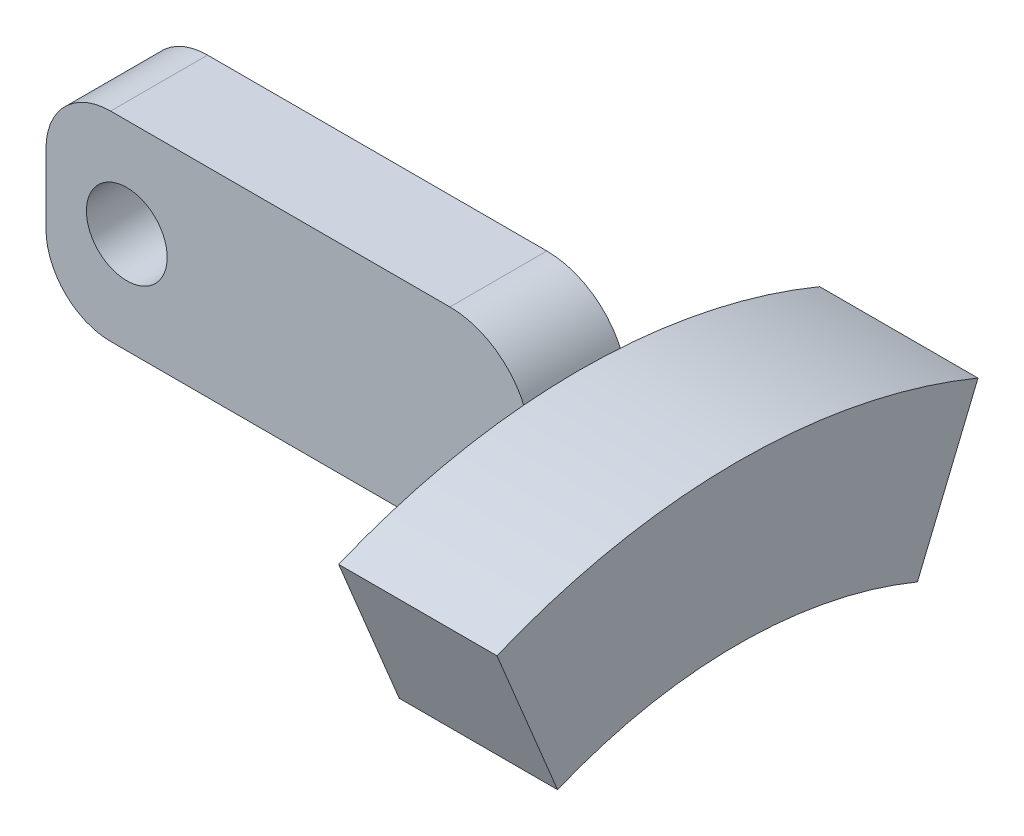
ISO-10303-21;
HEADER;
FILE_DESCRIPTION(('STEP AP214'),'2;1');
FILE_NAME('part.step','',(''),(''),'','','');
FILE_SCHEMA(('AUTOMOTIVE_DESIGN { 1 0 10303 214 1 1 1 1 }'));
ENDSEC;
DATA;
#1=APPLICATION_CONTEXT('core data for automotive mechanical design processes');
#2=APPLICATION_PROTOCOL_DEFINITION('international standard','automotive_design',2000,#1);
#3=PRODUCT_CONTEXT('',#1,'mechanical');
#4=PRODUCT('Part','Part','',(#3));
#5=PRODUCT_RELATED_PRODUCT_CATEGORY('part','',(#4));
#6=PRODUCT_DEFINITION_FORMATION('','',#4);
#7=PRODUCT_DEFINITION_CONTEXT('part definition',#1,'design');
#8=PRODUCT_DEFINITION('design','',#6,#7);
#9=PRODUCT_DEFINITION_SHAPE('','',#8);
#10=(LENGTH_UNIT() NAMED_UNIT(*) SI_UNIT(.MILLI.,.METRE.));
#11=(NAMED_UNIT(*) PLANE_ANGLE_UNIT() SI_UNIT($,.RADIAN.));
#12=(NAMED_UNIT(*) SI_UNIT($,.STERADIAN.) SOLID_ANGLE_UNIT());
#13=UNCERTAINTY_MEASURE_WITH_UNIT(LENGTH_MEASURE(1.E-05),#10,'distance_accuracy_value','');
#14=(GEOMETRIC_REPRESENTATION_CONTEXT(3) GLOBAL_UNCERTAINTY_ASSIGNED_CONTEXT((#13)) GLOBAL_UNIT_ASSIGNED_CONTEXT((#10,
#11,#12)) REPRESENTATION_CONTEXT('',''));
#15=CARTESIAN_POINT('',(0.,0.,0.));
#16=DIRECTION('',(0.,0.,1.));
#17=DIRECTION('',(1.,0.,0.));
#18=AXIS2_PLACEMENT_3D('',#15,#16,#17);
#19=CARTESIAN_POINT('',(10.1,41.2944031035636,-3.));
#20=DIRECTION('',(0.,-1.,0.));
#21=DIRECTION('',(0.,0.,-1.));
#22=AXIS2_PLACEMENT_3D('',#19,#20,#21);
#23=PLANE('',#22);
#24=DIRECTION('',(1.,0.,0.));
#25=VECTOR('',#24,1.);
#26=CARTESIAN_POINT('',(10.1,41.2944031035636,3.));
#27=LINE('',#26,#25);
#28=CARTESIAN_POINT('',(14.1,41.2944031035636,3.));
#29=VERTEX_POINT('',#28);
#30=CARTESIAN_POINT('',(35.1,41.2944031035636,3.));
#31=VERTEX_POINT('',#30);
#32=EDGE_CURVE('E136',#29,#31,#27,.T.);
#33=ORIENTED_EDGE('',*,*,#32,.T.);
#34=DIRECTION('',(0.,0.,-1.));
#35=VECTOR('',#34,1.);
#36=CARTESIAN_POINT('',(35.1,41.2944031035636,-3.));
#37=LINE('',#36,#35);
#38=CARTESIAN_POINT('',(35.1,41.2944031035636,-3.));
#39=VERTEX_POINT('',#38);
#40=EDGE_CURVE('E188',#31,#39,#37,.T.);
#41=ORIENTED_EDGE('',*,*,#40,.T.);
#42=DIRECTION('',(1.,0.,0.));
#43=VECTOR('',#42,1.);
#44=CARTESIAN_POINT('',(10.1,41.2944031035636,-3.));
#45=LINE('',#44,#43);
#46=CARTESIAN_POINT('',(14.1,41.2944031035636,-3.));
#47=VERTEX_POINT('',#46);
#48=EDGE_CURVE('E126',#47,#39,#45,.T.);
#49=ORIENTED_EDGE('',*,*,#48,.F.);
#50=DIRECTION('',(0.,0.,-1.));
#51=VECTOR('',#50,1.);
#52=CARTESIAN_POINT('',(14.1,41.2944031035636,3.));
#53=LINE('',#52,#51);
#54=EDGE_CURVE('E185',#47,#29,#53,.F.);
#55=ORIENTED_EDGE('',*,*,#54,.T.);
#56=EDGE_LOOP('',(#33,#41,#49,#55));
#57=FACE_BOUND('',#56,.T.);
#58=ADVANCED_FACE('F55',(#57),#23,.F.);
#59=CARTESIAN_POINT('',(10.1,41.2944031035636,-3.));
#60=DIRECTION('',(0.,0.,1.));
#61=DIRECTION('',(0.,-1.,0.));
#62=AXIS2_PLACEMENT_3D('',#59,#60,#61);
#63=PLANE('',#62);
#64=CARTESIAN_POINT('',(15.1,35.1972015517818,-3.));
#65=DIRECTION('',(0.,0.,1.));
#66=DIRECTION('',(0.,-1.,0.));
#67=AXIS2_PLACEMENT_3D('',#64,#65,#66);
#68=CIRCLE('',#67,2.5);
#69=CARTESIAN_POINT('',(15.1,32.6972015517818,-3.));
#70=VERTEX_POINT('',#69);
#71=EDGE_CURVE('E118',#70,#70,#68,.T.);
#72=ORIENTED_EDGE('',*,*,#71,.T.);
#73=EDGE_LOOP('',(#72));
#74=FACE_BOUND('',#73,.T.);
#75=ORIENTED_EDGE('',*,*,#48,.T.);
#76=CARTESIAN_POINT('',(35.1,36.2944031035636,-3.));
#77=DIRECTION('',(0.,0.,1.));
#78=DIRECTION('',(0.,-1.,0.));
#79=AXIS2_PLACEMENT_3D('',#76,#77,#78);
#80=CIRCLE('',#79,5.);
#81=CARTESIAN_POINT('',(40.1,36.2944031035636,-3.));
#82=VERTEX_POINT('',#81);
#83=EDGE_CURVE('E77',#39,#82,#80,.F.);
#84=ORIENTED_EDGE('',*,*,#83,.T.);
#85=DIRECTION('',(0.,-1.,0.));
#86=VECTOR('',#85,1.);
#87=CARTESIAN_POINT('',(40.1,41.2944031035636,-3.));
#88=LINE('',#87,#86);
#89=CARTESIAN_POINT('',(40.1,28.9449477456775,-3.));
#90=VERTEX_POINT('',#89);
#91=EDGE_CURVE('E111',#82,#90,#88,.T.);
#92=ORIENTED_EDGE('',*,*,#91,.T.);
#93=DIRECTION('',(1.,0.,0.));
#94=VECTOR('',#93,1.);
#95=CARTESIAN_POINT('',(10.1,28.9449477456775,-3.));
#96=LINE('',#95,#94);
#97=CARTESIAN_POINT('',(14.1,28.9449477456775,-3.));
#98=VERTEX_POINT('',#97);
#99=EDGE_CURVE('E114',#98,#90,#96,.T.);
#100=ORIENTED_EDGE('',*,*,#99,.F.);
#101=CARTESIAN_POINT('',(14.1,28.9449477456775,-3.));
#102=CARTESIAN_POINT('',(13.987911701672,28.9449365296965,-3.));
#103=CARTESIAN_POINT('',(13.8758287296766,28.9496843426297,-3.));
#104=CARTESIAN_POINT('',(13.652468442977,28.9686113164184,-3.));
#105=CARTESIAN_POINT('',(13.5411910804157,28.9827899123141,-3.));
#106=CARTESIAN_POINT('',(13.3203246878193,29.0204744795727,-3.));
#107=CARTESIAN_POINT('',(13.2107342035032,29.0439718880027,-3.));
#108=CARTESIAN_POINT('',(12.993949595961,29.1000974997194,-3.));
#109=CARTESIAN_POINT('',(12.8867554490874,29.132725612859,-3.));
#110=CARTESIAN_POINT('',(12.5698126992693,29.2440266261888,-3.));
#111=CARTESIAN_POINT('',(12.3646004388537,29.3361339418714,-3.));
#112=CARTESIAN_POINT('',(11.9726418530708,29.5533499870256,-3.));
#113=CARTESIAN_POINT('',(11.7858931662244,29.6784544886523,-3.));
#114=CARTESIAN_POINT('',(11.4354434163125,29.9584576616101,-3.));
#115=CARTESIAN_POINT('',(11.2718016837578,30.1134306982814,-3.));
#116=CARTESIAN_POINT('',(10.9726799621646,30.4485622021566,-3.));
#117=CARTESIAN_POINT('',(10.8372058326413,30.6287258965913,-3.));
#118=CARTESIAN_POINT('',(10.5975779064986,31.0100615952064,-3.));
#119=CARTESIAN_POINT('',(10.49358653858,31.2113355697543,-3.));
#120=CARTESIAN_POINT('',(10.3207757310185,31.6284030631866,-3.));
#121=CARTESIAN_POINT('',(10.2519376220519,31.8441888060493,-3.));
#122=CARTESIAN_POINT('',(10.1678518012988,32.2116219096907,-3.));
#123=CARTESIAN_POINT('',(10.1424246479984,32.3610204352467,-3.));
#124=CARTESIAN_POINT('',(10.1085002691529,32.6615149256522,-3.));
#125=CARTESIAN_POINT('',(10.0999793841804,32.8126082203412,-3.));
#126=CARTESIAN_POINT('',(10.1,32.9637679885052,-3.));
#127=B_SPLINE_CURVE_WITH_KNOTS('',3,(#101,#102,#103,#104,#105,#106,#107,#108,#109,#110,#111,
#112,#113,#114,#115,#116,#117,#118,#119,#120,#121,#122,#123,#124,#125,#126),.UNSPECIFIED.,.F.,
.F.,(4,2,2,2,2,2,2,2,2,2,2,2,4),(0.,0.336154829389086,0.6722895229206,1.00811605974132,
1.34393928107505,2.01527510623804,2.68652495661045,3.35946816334935,4.03255121814212,
4.70904993867168,5.38518900712091,5.83893480406394,6.29204515864262),.UNSPECIFIED.);
#128=CARTESIAN_POINT('',(10.1,32.9637679885052,-3.));
#129=VERTEX_POINT('',#128);
#130=EDGE_CURVE('E179',#98,#129,#127,.T.);
#131=ORIENTED_EDGE('',*,*,#130,.T.);
#132=DIRECTION('',(0.,-1.,0.));
#133=VECTOR('',#132,1.);
#134=CARTESIAN_POINT('',(10.1,41.2944031035636,-3.));
#135=LINE('',#134,#133);
#136=CARTESIAN_POINT('',(10.1,37.2944031035636,-3.));
#137=VERTEX_POINT('',#136);
#138=EDGE_CURVE('E132',#137,#129,#135,.T.);
#139=ORIENTED_EDGE('',*,*,#138,.F.);
#140=CARTESIAN_POINT('',(14.1,37.2944031035636,-3.));
#141=DIRECTION('',(0.,0.,1.));
#142=DIRECTION('',(0.,-1.,0.));
#143=AXIS2_PLACEMENT_3D('',#140,#141,#142);
#144=CIRCLE('',#143,4.);
#145=EDGE_CURVE('E186',#137,#47,#144,.F.);
#146=ORIENTED_EDGE('',*,*,#145,.T.);
#147=EDGE_LOOP('',(#75,#84,#92,#100,#131,#139,#146));
#148=FACE_BOUND('',#147,.T.);
#149=ADVANCED_FACE('F113',(#74,#148),#63,.F.);
#150=CARTESIAN_POINT('',(10.1,0.,0.));
#151=DIRECTION('',(1.,0.,0.));
#152=DIRECTION('',(0.,0.,-1.));
#153=AXIS2_PLACEMENT_3D('',#150,#151,#152);
#154=CYLINDRICAL_SURFACE('',#153,29.1);
#155=DIRECTION('',(1.,0.,0.));
#156=VECTOR('',#155,1.);
#157=CARTESIAN_POINT('',(10.1,28.9449477456775,3.));
#158=LINE('',#157,#156);
#159=CARTESIAN_POINT('',(14.1,28.9449477456775,3.));
#160=VERTEX_POINT('',#159);
#161=CARTESIAN_POINT('',(40.1,28.9449477456775,3.));
#162=VERTEX_POINT('',#161);
#163=EDGE_CURVE('E127',#160,#162,#158,.T.);
#164=ORIENTED_EDGE('',*,*,#163,.F.);
#165=CARTESIAN_POINT('',(14.1,0.,0.));
#166=DIRECTION('',(-1.,0.,0.));
#167=DIRECTION('',(0.,0.,1.));
#168=AXIS2_PLACEMENT_3D('',#165,#166,#167);
#169=CIRCLE('',#168,29.1);
#170=EDGE_CURVE('E125',#160,#98,#169,.T.);
#171=ORIENTED_EDGE('',*,*,#170,.T.);
#172=ORIENTED_EDGE('',*,*,#99,.T.);
#173=CARTESIAN_POINT('',(40.1,0.,0.));
#174=DIRECTION('',(1.,0.,0.));
#175=DIRECTION('',(0.,0.,1.));
#176=AXIS2_PLACEMENT_3D('',#173,#174,#175);
#177=CIRCLE('',#176,29.1);
#178=EDGE_CURVE('E117',#90,#162,#177,.T.);
#179=ORIENTED_EDGE('',*,*,#178,.T.);
#180=EDGE_LOOP('',(#164,#171,#172,#179));
#181=FACE_BOUND('',#180,.T.);
#182=ADVANCED_FACE('F123',(#181),#154,.F.);
#183=CARTESIAN_POINT('',(10.1,41.2944031035636,3.));
#184=DIRECTION('',(0.,0.,-1.));
#185=DIRECTION('',(0.,1.,0.));
#186=AXIS2_PLACEMENT_3D('',#183,#184,#185);
#187=PLANE('',#186);
#188=CARTESIAN_POINT('',(15.1,35.1972015517818,3.));
#189=DIRECTION('',(0.,0.,-1.));
#190=DIRECTION('',(0.,1.,0.));
#191=AXIS2_PLACEMENT_3D('',#188,#189,#190);
#192=CIRCLE('',#191,2.5);
#193=CARTESIAN_POINT('',(15.1,37.6972015517818,3.));
#194=VERTEX_POINT('',#193);
#195=EDGE_CURVE('E143',#194,#194,#192,.T.);
#196=ORIENTED_EDGE('',*,*,#195,.T.);
#197=EDGE_LOOP('',(#196));
#198=FACE_BOUND('',#197,.T.);
#199=DIRECTION('',(0.,1.,0.));
#200=VECTOR('',#199,1.);
#201=CARTESIAN_POINT('',(40.1,41.2944031035636,3.));
#202=LINE('',#201,#200);
#203=CARTESIAN_POINT('',(40.1,36.2944031035636,3.));
#204=VERTEX_POINT('',#203);
#205=EDGE_CURVE('E130',#162,#204,#202,.T.);
#206=ORIENTED_EDGE('',*,*,#205,.T.);
#207=CARTESIAN_POINT('',(35.1,36.2944031035636,3.));
#208=DIRECTION('',(0.,0.,-1.));
#209=DIRECTION('',(0.,1.,0.));
#210=AXIS2_PLACEMENT_3D('',#207,#208,#209);
#211=CIRCLE('',#210,5.);
#212=EDGE_CURVE('E14',#204,#31,#211,.F.);
#213=ORIENTED_EDGE('',*,*,#212,.T.);
#214=ORIENTED_EDGE('',*,*,#32,.F.);
#215=CARTESIAN_POINT('',(14.1,37.2944031035636,3.));
#216=DIRECTION('',(0.,0.,-1.));
#217=DIRECTION('',(0.,1.,0.));
#218=AXIS2_PLACEMENT_3D('',#215,#216,#217);
#219=CIRCLE('',#218,4.);
#220=CARTESIAN_POINT('',(10.1,37.2944031035636,3.));
#221=VERTEX_POINT('',#220);
#222=EDGE_CURVE('E151',#29,#221,#219,.F.);
#223=ORIENTED_EDGE('',*,*,#222,.T.);
#224=DIRECTION('',(0.,1.,0.));
#225=VECTOR('',#224,1.);
#226=CARTESIAN_POINT('',(10.1,41.2944031035636,3.));
#227=LINE('',#226,#225);
#228=CARTESIAN_POINT('',(10.1,32.9637679885052,3.));
#229=VERTEX_POINT('',#228);
#230=EDGE_CURVE('E139',#229,#221,#227,.T.);
#231=ORIENTED_EDGE('',*,*,#230,.F.);
#232=CARTESIAN_POINT('',(10.1,32.9637679885052,3.));
#233=CARTESIAN_POINT('',(10.0999894630734,32.8503761941966,3.));
#234=CARTESIAN_POINT('',(10.1047820029652,32.7369896144603,3.));
#235=CARTESIAN_POINT('',(10.1238890670256,32.5110264320479,3.));
#236=CARTESIAN_POINT('',(10.1382031690908,32.3984497936896,3.));
#237=CARTESIAN_POINT('',(10.1762566994306,32.1749692735513,3.));
#238=CARTESIAN_POINT('',(10.1999899301054,32.0640643415282,3.));
#239=CARTESIAN_POINT('',(10.2566913428772,31.8446743251634,3.));
#240=CARTESIAN_POINT('',(10.2896594101887,31.7361892107623,3.));
#241=CARTESIAN_POINT('',(10.4021560851136,31.4154068458037,3.));
#242=CARTESIAN_POINT('',(10.4952920016183,31.2076958788805,3.));
#243=CARTESIAN_POINT('',(10.7150976960876,30.8110427910689,3.));
#244=CARTESIAN_POINT('',(10.841760822432,30.622096957492,3.));
#245=CARTESIAN_POINT('',(11.1249143163001,30.2684598302414,3.));
#246=CARTESIAN_POINT('',(11.2813618285916,30.1037342835186,3.));
#247=CARTESIAN_POINT('',(11.6198320766455,29.8029973694966,3.));
#248=CARTESIAN_POINT('',(11.8018595197146,29.6669912988086,3.));
#249=CARTESIAN_POINT('',(12.1854866290644,29.428200231,3.));
#250=CARTESIAN_POINT('',(12.3870036190849,29.325282273917,3.));
#251=CARTESIAN_POINT('',(12.8044687909684,29.1549841535169,3.));
#252=CARTESIAN_POINT('',(13.0204073440457,29.0875805405402,3.));
#253=CARTESIAN_POINT('',(13.3814786653017,29.0076858830711,3.));
#254=CARTESIAN_POINT('',(13.5242678753384,28.9841735509533,3.));
#255=CARTESIAN_POINT('',(13.8113505962621,28.9528069255803,3.));
#256=CARTESIAN_POINT('',(13.9556416897111,28.9449304991282,3.));
#257=CARTESIAN_POINT('',(14.1,28.9449477456775,3.));
#258=B_SPLINE_CURVE_WITH_KNOTS('',3,(#232,#233,#234,#235,#236,#237,#238,#239,#240,#241,#242,
#243,#244,#245,#246,#247,#248,#249,#250,#251,#252,#253,#254,#255,#256,#257),.UNSPECIFIED.,.F.,
.F.,(4,2,2,2,2,2,2,2,2,2,2,2,4),(0.,0.34006477218564,0.680114469862005,1.01994079154788,
1.35976288950782,2.0391465436105,2.7183955125041,3.3966744319169,4.07507833439707,
4.75072106708512,5.42591712081748,5.85926027781414,6.29198958305409),.UNSPECIFIED.);
#259=EDGE_CURVE('E153',#229,#160,#258,.T.);
#260=ORIENTED_EDGE('',*,*,#259,.T.);
#261=ORIENTED_EDGE('',*,*,#163,.T.);
#262=EDGE_LOOP('',(#206,#213,#214,#223,#231,#260,#261));
#263=FACE_BOUND('',#262,.T.);
#264=ADVANCED_FACE('F165',(#198,#263),#187,.F.);
#265=CARTESIAN_POINT('',(10.1,0.,0.));
#266=DIRECTION('',(-1.,0.,0.));
#267=DIRECTION('',(0.,0.,1.));
#268=AXIS2_PLACEMENT_3D('',#265,#266,#267);
#269=PLANE('',#268);
#270=ORIENTED_EDGE('',*,*,#138,.T.);
#271=CARTESIAN_POINT('',(10.1,0.,0.));
#272=DIRECTION('',(-1.,0.,0.));
#273=DIRECTION('',(0.,0.,1.));
#274=AXIS2_PLACEMENT_3D('',#271,#272,#273);
#275=CIRCLE('',#274,33.1);
#276=EDGE_CURVE('E148',#129,#229,#275,.F.);
#277=ORIENTED_EDGE('',*,*,#276,.T.);
#278=ORIENTED_EDGE('',*,*,#230,.T.);
#279=DIRECTION('',(0.,0.,-1.));
#280=VECTOR('',#279,1.);
#281=CARTESIAN_POINT('',(10.1,37.2944031035636,-3.));
#282=LINE('',#281,#280);
#283=EDGE_CURVE('E142',#221,#137,#282,.T.);
#284=ORIENTED_EDGE('',*,*,#283,.T.);
#285=EDGE_LOOP('',(#270,#277,#278,#284));
#286=FACE_BOUND('',#285,.T.);
#287=ADVANCED_FACE('F170',(#286),#269,.T.);
#288=CARTESIAN_POINT('',(40.1,0.,0.));
#289=DIRECTION('',(-1.,0.,0.));
#290=DIRECTION('',(0.,0.,1.));
#291=AXIS2_PLACEMENT_3D('',#288,#289,#290);
#292=PLANE('',#291);
#293=ORIENTED_EDGE('',*,*,#91,.F.);
#294=DIRECTION('',(0.,0.,-1.));
#295=VECTOR('',#294,1.);
#296=CARTESIAN_POINT('',(40.1,36.2944031035636,0.));
#297=LINE('',#296,#295);
#298=EDGE_CURVE('E63',#82,#204,#297,.F.);
#299=ORIENTED_EDGE('',*,*,#298,.T.);
#300=ORIENTED_EDGE('',*,*,#205,.F.);
#301=ORIENTED_EDGE('',*,*,#178,.F.);
#302=EDGE_LOOP('',(#293,#299,#300,#301));
#303=FACE_BOUND('',#302,.T.);
#304=ADVANCED_FACE('F129',(#303),#292,.F.);
#305=CARTESIAN_POINT('',(15.1,35.1972015517818,-25.));
#306=DIRECTION('',(0.,0.,1.));
#307=DIRECTION('',(1.,0.,0.));
#308=AXIS2_PLACEMENT_3D('',#305,#306,#307);
#309=CYLINDRICAL_SURFACE('',#308,2.5);
#310=ORIENTED_EDGE('',*,*,#195,.F.);
#311=EDGE_LOOP('',(#310));
#312=FACE_BOUND('',#311,.T.);
#313=ORIENTED_EDGE('',*,*,#71,.F.);
#314=EDGE_LOOP('',(#313));
#315=FACE_BOUND('',#314,.T.);
#316=ADVANCED_FACE('F214',(#312,#315),#309,.F.);
#317=CARTESIAN_POINT('',(14.1,0.,0.));
#318=DIRECTION('',(-1.,0.,0.));
#319=DIRECTION('',(0.,0.,1.));
#320=AXIS2_PLACEMENT_3D('',#317,#318,#319);
#321=TOROIDAL_SURFACE('',#320,33.1,4.);
#322=ORIENTED_EDGE('',*,*,#130,.F.);
#323=ORIENTED_EDGE('',*,*,#170,.F.);
#324=ORIENTED_EDGE('',*,*,#259,.F.);
#325=ORIENTED_EDGE('',*,*,#276,.F.);
#326=EDGE_LOOP('',(#322,#323,#324,#325));
#327=FACE_BOUND('',#326,.T.);
#328=ADVANCED_FACE('F162',(#327),#321,.T.);
#329=CARTESIAN_POINT('',(14.1,37.2944031035636,0.));
#330=DIRECTION('',(0.,0.,1.));
#331=DIRECTION('',(1.,0.,0.));
#332=AXIS2_PLACEMENT_3D('',#329,#330,#331);
#333=CYLINDRICAL_SURFACE('',#332,4.);
#334=ORIENTED_EDGE('',*,*,#222,.F.);
#335=ORIENTED_EDGE('',*,*,#54,.F.);
#336=ORIENTED_EDGE('',*,*,#145,.F.);
#337=ORIENTED_EDGE('',*,*,#283,.F.);
#338=EDGE_LOOP('',(#334,#335,#336,#337));
#339=FACE_BOUND('',#338,.T.);
#340=ADVANCED_FACE('F203',(#339),#333,.T.);
#341=CARTESIAN_POINT('',(35.1,36.2944031035636,-3.));
#342=DIRECTION('',(0.,0.,-1.));
#343=DIRECTION('',(-1.,0.,0.));
#344=AXIS2_PLACEMENT_3D('',#341,#342,#343);
#345=CYLINDRICAL_SURFACE('',#344,5.);
#346=ORIENTED_EDGE('',*,*,#212,.F.);
#347=ORIENTED_EDGE('',*,*,#298,.F.);
#348=ORIENTED_EDGE('',*,*,#83,.F.);
#349=ORIENTED_EDGE('',*,*,#40,.F.);
#350=EDGE_LOOP('',(#346,#347,#348,#349));
#351=FACE_BOUND('',#350,.T.);
#352=ADVANCED_FACE('F57',(#351),#345,.T.);
#353=CLOSED_SHELL('',(#58,#149,#182,#264,#287,#304,#316,#328,#340,#352));
#354=MANIFOLD_SOLID_BREP('B2',#353);
#355=CARTESIAN_POINT('',(49.9,35.9389138146891,-14.886385519002));
#356=DIRECTION('',(1.,0.,0.));
#357=DIRECTION('',(0.,0.,-1.));
#358=AXIS2_PLACEMENT_3D('',#355,#356,#357);
#359=PLANE('',#358);
#360=CARTESIAN_POINT('',(49.9,0.,0.));
#361=DIRECTION('',(1.,0.,0.));
#362=DIRECTION('',(0.,0.,-1.));
#363=AXIS2_PLACEMENT_3D('',#360,#361,#362);
#364=CIRCLE('',#363,29.1);
#365=CARTESIAN_POINT('',(49.9,26.8848943960784,-11.1360878818241));
#366=VERTEX_POINT('',#365);
#367=CARTESIAN_POINT('',(49.9,26.8848943960784,11.1360878818241));
#368=VERTEX_POINT('',#367);
#369=EDGE_CURVE('E53',#366,#368,#364,.T.);
#370=ORIENTED_EDGE('',*,*,#369,.F.);
#371=DIRECTION('',(0.,0.923879532511287,-0.382683432365091));
#372=VECTOR('',#371,1.);
#373=CARTESIAN_POINT('',(49.9,35.9389138146891,-14.886385519002));
#374=LINE('',#373,#372);
#375=CARTESIAN_POINT('',(49.9,35.9389138146891,-14.886385519002));
#376=VERTEX_POINT('',#375);
#377=EDGE_CURVE('E330',#366,#376,#374,.T.);
#378=ORIENTED_EDGE('',*,*,#377,.T.);
#379=CARTESIAN_POINT('',(49.9,0.,0.));
#380=DIRECTION('',(1.,0.,0.));
#381=DIRECTION('',(0.,0.,-1.));
#382=AXIS2_PLACEMENT_3D('',#379,#380,#381);
#383=CIRCLE('',#382,38.9);
#384=CARTESIAN_POINT('',(49.9,35.9389138146891,14.886385519002));
#385=VERTEX_POINT('',#384);
#386=EDGE_CURVE('E325',#376,#385,#383,.T.);
#387=ORIENTED_EDGE('',*,*,#386,.T.);
#388=DIRECTION('',(0.,0.923879532511287,0.382683432365091));
#389=VECTOR('',#388,1.);
#390=CARTESIAN_POINT('',(49.9,35.9389138146891,14.886385519002));
#391=LINE('',#390,#389);
#392=EDGE_CURVE('E328',#368,#385,#391,.T.);
#393=ORIENTED_EDGE('',*,*,#392,.F.);
#394=EDGE_LOOP('',(#370,#378,#387,#393));
#395=FACE_BOUND('',#394,.T.);
#396=ADVANCED_FACE('F289',(#395),#359,.T.);
#397=CARTESIAN_POINT('',(66.456117982043,0.,0.));
#398=DIRECTION('',(1.,0.,0.));
#399=DIRECTION('',(0.,0.,-1.));
#400=AXIS2_PLACEMENT_3D('',#397,#398,#399);
#401=CYLINDRICAL_SURFACE('',#400,29.1);
#402=CARTESIAN_POINT('',(40.1,0.,0.));
#403=DIRECTION('',(1.,0.,0.));
#404=DIRECTION('',(0.,0.,-1.));
#405=AXIS2_PLACEMENT_3D('',#402,#403,#404);
#406=CIRCLE('',#405,29.1);
#407=CARTESIAN_POINT('',(40.1,26.8848943960784,-11.1360878818241));
#408=VERTEX_POINT('',#407);
#409=CARTESIAN_POINT('',(40.1,26.8848943960784,11.1360878818241));
#410=VERTEX_POINT('',#409);
#411=EDGE_CURVE('E297',#408,#410,#406,.T.);
#412=ORIENTED_EDGE('',*,*,#411,.F.);
#413=DIRECTION('',(1.,0.,0.));
#414=VECTOR('',#413,1.);
#415=CARTESIAN_POINT('',(49.9,26.8848943960784,-11.1360878818241));
#416=LINE('',#415,#414);
#417=EDGE_CURVE('E335',#408,#366,#416,.T.);
#418=ORIENTED_EDGE('',*,*,#417,.T.);
#419=ORIENTED_EDGE('',*,*,#369,.T.);
#420=DIRECTION('',(1.,0.,0.));
#421=VECTOR('',#420,1.);
#422=CARTESIAN_POINT('',(49.9,26.8848943960784,11.1360878818241));
#423=LINE('',#422,#421);
#424=EDGE_CURVE('E347',#410,#368,#423,.T.);
#425=ORIENTED_EDGE('',*,*,#424,.F.);
#426=EDGE_LOOP('',(#412,#418,#419,#425));
#427=FACE_BOUND('',#426,.T.);
#428=ADVANCED_FACE('F291',(#427),#401,.F.);
#429=CARTESIAN_POINT('',(40.1,35.9389138146891,-14.886385519002));
#430=DIRECTION('',(-1.,0.,0.));
#431=DIRECTION('',(0.,0.,1.));
#432=AXIS2_PLACEMENT_3D('',#429,#430,#431);
#433=PLANE('',#432);
#434=CARTESIAN_POINT('',(40.1,0.,0.));
#435=DIRECTION('',(1.,0.,0.));
#436=DIRECTION('',(0.,0.,-1.));
#437=AXIS2_PLACEMENT_3D('',#434,#435,#436);
#438=CIRCLE('',#437,38.9);
#439=CARTESIAN_POINT('',(40.1,35.9389138146891,-14.886385519002));
#440=VERTEX_POINT('',#439);
#441=CARTESIAN_POINT('',(40.1,35.9389138146891,14.886385519002));
#442=VERTEX_POINT('',#441);
#443=EDGE_CURVE('E334',#440,#442,#438,.T.);
#444=ORIENTED_EDGE('',*,*,#443,.F.);
#445=DIRECTION('',(0.,-0.923879532511287,0.382683432365091));
#446=VECTOR('',#445,1.);
#447=CARTESIAN_POINT('',(40.1,35.9389138146891,-14.886385519002));
#448=LINE('',#447,#446);
#449=EDGE_CURVE('E355',#440,#408,#448,.T.);
#450=ORIENTED_EDGE('',*,*,#449,.T.);
#451=ORIENTED_EDGE('',*,*,#411,.T.);
#452=DIRECTION('',(0.,-0.923879532511287,-0.382683432365091));
#453=VECTOR('',#452,1.);
#454=CARTESIAN_POINT('',(40.1,35.9389138146891,14.886385519002));
#455=LINE('',#454,#453);
#456=EDGE_CURVE('E343',#442,#410,#455,.T.);
#457=ORIENTED_EDGE('',*,*,#456,.F.);
#458=EDGE_LOOP('',(#444,#450,#451,#457));
#459=FACE_BOUND('',#458,.T.);
#460=ADVANCED_FACE('F359',(#459),#433,.T.);
#461=CARTESIAN_POINT('',(66.456117982043,0.,0.));
#462=DIRECTION('',(1.,0.,0.));
#463=DIRECTION('',(0.,0.,-1.));
#464=AXIS2_PLACEMENT_3D('',#461,#462,#463);
#465=CYLINDRICAL_SURFACE('',#464,38.9);
#466=DIRECTION('',(-1.,0.,0.));
#467=VECTOR('',#466,1.);
#468=CARTESIAN_POINT('',(49.9,35.9389138146891,-14.886385519002));
#469=LINE('',#468,#467);
#470=EDGE_CURVE('E353',#376,#440,#469,.T.);
#471=ORIENTED_EDGE('',*,*,#470,.T.);
#472=ORIENTED_EDGE('',*,*,#443,.T.);
#473=DIRECTION('',(-1.,0.,0.));
#474=VECTOR('',#473,1.);
#475=CARTESIAN_POINT('',(49.9,35.9389138146891,14.886385519002));
#476=LINE('',#475,#474);
#477=EDGE_CURVE('E338',#385,#442,#476,.T.);
#478=ORIENTED_EDGE('',*,*,#477,.F.);
#479=ORIENTED_EDGE('',*,*,#386,.F.);
#480=EDGE_LOOP('',(#471,#472,#478,#479));
#481=FACE_BOUND('',#480,.T.);
#482=ADVANCED_FACE('F339',(#481),#465,.T.);
#483=CARTESIAN_POINT('',(0.,0.,0.));
#484=DIRECTION('',(0.,-0.382683432365091,-0.923879532511287));
#485=DIRECTION('',(-1.,0.,0.));
#486=AXIS2_PLACEMENT_3D('',#483,#484,#485);
#487=PLANE('',#486);
#488=ORIENTED_EDGE('',*,*,#377,.F.);
#489=ORIENTED_EDGE('',*,*,#417,.F.);
#490=ORIENTED_EDGE('',*,*,#449,.F.);
#491=ORIENTED_EDGE('',*,*,#470,.F.);
#492=EDGE_LOOP('',(#488,#489,#490,#491));
#493=FACE_BOUND('',#492,.T.);
#494=ADVANCED_FACE('F363',(#493),#487,.T.);
#495=CARTESIAN_POINT('',(0.,0.,0.));
#496=DIRECTION('',(0.,0.382683432365091,-0.923879532511287));
#497=DIRECTION('',(-1.,0.,0.));
#498=AXIS2_PLACEMENT_3D('',#495,#496,#497);
#499=PLANE('',#498);
#500=ORIENTED_EDGE('',*,*,#392,.T.);
#501=ORIENTED_EDGE('',*,*,#477,.T.);
#502=ORIENTED_EDGE('',*,*,#456,.T.);
#503=ORIENTED_EDGE('',*,*,#424,.T.);
#504=EDGE_LOOP('',(#500,#501,#502,#503));
#505=FACE_BOUND('',#504,.T.);
#506=ADVANCED_FACE('F346',(#505),#499,.F.);
#507=CLOSED_SHELL('',(#396,#428,#460,#482,#494,#506));
#508=MANIFOLD_SOLID_BREP('B8',#507);
#509=ADVANCED_BREP_SHAPE_REPRESENTATION('',(#18,#354,#508),#14);
#510=SHAPE_DEFINITION_REPRESENTATION(#9,#509);
ENDSEC;
END-ISO-10303-21;
